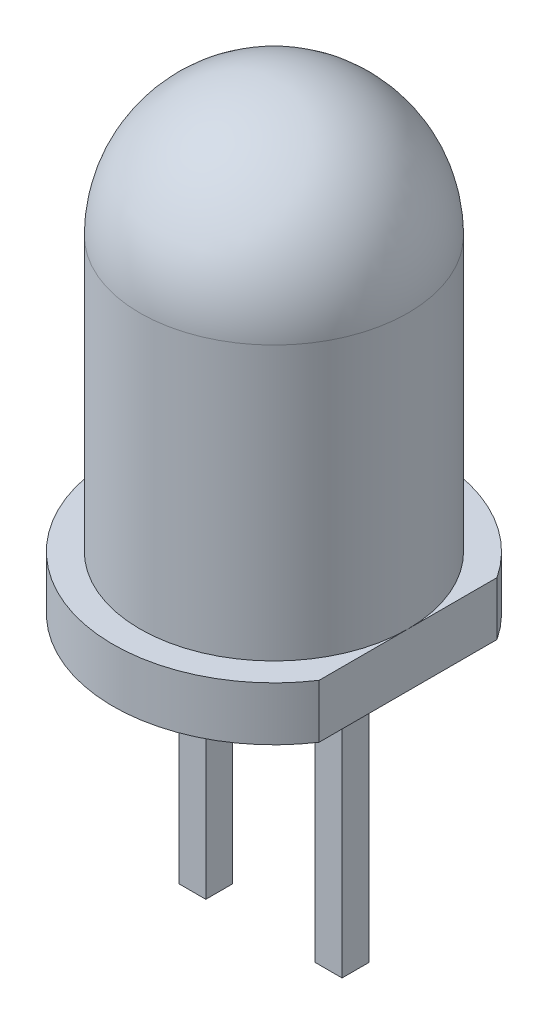
ISO-10303-21;
HEADER;
FILE_DESCRIPTION(('STEP AP214'),'2;1');
FILE_NAME('part.step','',(''),(''),'','','');
FILE_SCHEMA(('AUTOMOTIVE_DESIGN { 1 0 10303 214 1 1 1 1 }'));
ENDSEC;
DATA;
#1=APPLICATION_CONTEXT('core data for automotive mechanical design processes');
#2=APPLICATION_PROTOCOL_DEFINITION('international standard','automotive_design',2000,#1);
#3=PRODUCT_CONTEXT('',#1,'mechanical');
#4=PRODUCT('Part','Part','',(#3));
#5=PRODUCT_RELATED_PRODUCT_CATEGORY('part','',(#4));
#6=PRODUCT_DEFINITION_FORMATION('','',#4);
#7=PRODUCT_DEFINITION_CONTEXT('part definition',#1,'design');
#8=PRODUCT_DEFINITION('design','',#6,#7);
#9=PRODUCT_DEFINITION_SHAPE('','',#8);
#10=(LENGTH_UNIT() NAMED_UNIT(*) SI_UNIT(.MILLI.,.METRE.));
#11=(NAMED_UNIT(*) PLANE_ANGLE_UNIT() SI_UNIT($,.RADIAN.));
#12=(NAMED_UNIT(*) SI_UNIT($,.STERADIAN.) SOLID_ANGLE_UNIT());
#13=UNCERTAINTY_MEASURE_WITH_UNIT(LENGTH_MEASURE(1.E-05),#10,'distance_accuracy_value','');
#14=(GEOMETRIC_REPRESENTATION_CONTEXT(3) GLOBAL_UNCERTAINTY_ASSIGNED_CONTEXT((#13)) GLOBAL_UNIT_ASSIGNED_CONTEXT((#10,
#11,#12)) REPRESENTATION_CONTEXT('',''));
#15=CARTESIAN_POINT('',(0.,0.,0.));
#16=DIRECTION('',(0.,0.,1.));
#17=DIRECTION('',(1.,0.,0.));
#18=AXIS2_PLACEMENT_3D('',#15,#16,#17);
#19=CARTESIAN_POINT('',(-1.02,-5.,0.25));
#20=DIRECTION('',(-1.,0.,0.));
#21=DIRECTION('',(0.,0.,1.));
#22=AXIS2_PLACEMENT_3D('',#19,#20,#21);
#23=PLANE('',#22);
#24=DIRECTION('',(0.,0.,1.));
#25=VECTOR('',#24,1.);
#26=CARTESIAN_POINT('',(-1.02,0.,0.25));
#27=LINE('',#26,#25);
#28=CARTESIAN_POINT('',(-1.02,0.,-0.25));
#29=VERTEX_POINT('',#28);
#30=CARTESIAN_POINT('',(-1.02,0.,0.25));
#31=VERTEX_POINT('',#30);
#32=EDGE_CURVE('P0_E79',#29,#31,#27,.T.);
#33=ORIENTED_EDGE('',*,*,#32,.T.);
#34=DIRECTION('',(0.,1.,0.));
#35=VECTOR('',#34,1.);
#36=CARTESIAN_POINT('',(-1.02,-5.,0.25));
#37=LINE('',#36,#35);
#38=CARTESIAN_POINT('',(-1.02,-5.,0.25));
#39=VERTEX_POINT('',#38);
#40=EDGE_CURVE('P0_E10',#39,#31,#37,.T.);
#41=ORIENTED_EDGE('',*,*,#40,.F.);
#42=DIRECTION('',(0.,0.,1.));
#43=VECTOR('',#42,1.);
#44=CARTESIAN_POINT('',(-1.02,-5.,0.25));
#45=LINE('',#44,#43);
#46=CARTESIAN_POINT('',(-1.02,-5.,-0.25));
#47=VERTEX_POINT('',#46);
#48=EDGE_CURVE('P0_E67',#47,#39,#45,.T.);
#49=ORIENTED_EDGE('',*,*,#48,.F.);
#50=DIRECTION('',(0.,1.,0.));
#51=VECTOR('',#50,1.);
#52=CARTESIAN_POINT('',(-1.02,-5.,-0.25));
#53=LINE('',#52,#51);
#54=EDGE_CURVE('P0_E75',#47,#29,#53,.T.);
#55=ORIENTED_EDGE('',*,*,#54,.T.);
#56=EDGE_LOOP('',(#33,#41,#49,#55));
#57=FACE_BOUND('',#56,.T.);
#58=ADVANCED_FACE('P0_F16',(#57),#23,.F.);
#59=CARTESIAN_POINT('',(-1.52,-5.,0.25));
#60=DIRECTION('',(0.,0.,-1.));
#61=DIRECTION('',(-1.,0.,0.));
#62=AXIS2_PLACEMENT_3D('',#59,#60,#61);
#63=PLANE('',#62);
#64=DIRECTION('',(-1.,0.,0.));
#65=VECTOR('',#64,1.);
#66=CARTESIAN_POINT('',(-1.52,0.,0.25));
#67=LINE('',#66,#65);
#68=CARTESIAN_POINT('',(-1.52,0.,0.25));
#69=VERTEX_POINT('',#68);
#70=EDGE_CURVE('P0_E71',#31,#69,#67,.T.);
#71=ORIENTED_EDGE('',*,*,#70,.T.);
#72=DIRECTION('',(0.,1.,0.));
#73=VECTOR('',#72,1.);
#74=CARTESIAN_POINT('',(-1.52,-5.,0.25));
#75=LINE('',#74,#73);
#76=CARTESIAN_POINT('',(-1.52,-5.,0.25));
#77=VERTEX_POINT('',#76);
#78=EDGE_CURVE('P0_E24',#77,#69,#75,.T.);
#79=ORIENTED_EDGE('',*,*,#78,.F.);
#80=DIRECTION('',(-1.,0.,0.));
#81=VECTOR('',#80,1.);
#82=CARTESIAN_POINT('',(-1.52,-5.,0.25));
#83=LINE('',#82,#81);
#84=EDGE_CURVE('P0_E62',#39,#77,#83,.T.);
#85=ORIENTED_EDGE('',*,*,#84,.F.);
#86=ORIENTED_EDGE('',*,*,#40,.T.);
#87=EDGE_LOOP('',(#71,#79,#85,#86));
#88=FACE_BOUND('',#87,.T.);
#89=ADVANCED_FACE('P0_F70',(#88),#63,.F.);
#90=CARTESIAN_POINT('',(-1.52,-5.,0.25));
#91=DIRECTION('',(1.,0.,0.));
#92=DIRECTION('',(0.,0.,-1.));
#93=AXIS2_PLACEMENT_3D('',#90,#91,#92);
#94=PLANE('',#93);
#95=DIRECTION('',(0.,0.,-1.));
#96=VECTOR('',#95,1.);
#97=CARTESIAN_POINT('',(-1.52,0.,0.25));
#98=LINE('',#97,#96);
#99=CARTESIAN_POINT('',(-1.52,0.,-0.25));
#100=VERTEX_POINT('',#99);
#101=EDGE_CURVE('P0_E49',#69,#100,#98,.T.);
#102=ORIENTED_EDGE('',*,*,#101,.T.);
#103=DIRECTION('',(0.,1.,0.));
#104=VECTOR('',#103,1.);
#105=CARTESIAN_POINT('',(-1.52,-5.,-0.25));
#106=LINE('',#105,#104);
#107=CARTESIAN_POINT('',(-1.52,-5.,-0.25));
#108=VERTEX_POINT('',#107);
#109=EDGE_CURVE('P0_E72',#108,#100,#106,.T.);
#110=ORIENTED_EDGE('',*,*,#109,.F.);
#111=DIRECTION('',(0.,0.,-1.));
#112=VECTOR('',#111,1.);
#113=CARTESIAN_POINT('',(-1.52,-5.,0.25));
#114=LINE('',#113,#112);
#115=EDGE_CURVE('P0_E65',#77,#108,#114,.T.);
#116=ORIENTED_EDGE('',*,*,#115,.F.);
#117=ORIENTED_EDGE('',*,*,#78,.T.);
#118=EDGE_LOOP('',(#102,#110,#116,#117));
#119=FACE_BOUND('',#118,.T.);
#120=ADVANCED_FACE('P0_F73',(#119),#94,.F.);
#121=CARTESIAN_POINT('',(-1.52,-5.,-0.25));
#122=DIRECTION('',(0.,0.,1.));
#123=DIRECTION('',(1.,0.,0.));
#124=AXIS2_PLACEMENT_3D('',#121,#122,#123);
#125=PLANE('',#124);
#126=DIRECTION('',(1.,0.,0.));
#127=VECTOR('',#126,1.);
#128=CARTESIAN_POINT('',(-1.52,0.,-0.25));
#129=LINE('',#128,#127);
#130=EDGE_CURVE('P0_E55',#100,#29,#129,.T.);
#131=ORIENTED_EDGE('',*,*,#130,.T.);
#132=ORIENTED_EDGE('',*,*,#54,.F.);
#133=DIRECTION('',(1.,0.,0.));
#134=VECTOR('',#133,1.);
#135=CARTESIAN_POINT('',(-1.52,-5.,-0.25));
#136=LINE('',#135,#134);
#137=EDGE_CURVE('P0_E32',#108,#47,#136,.T.);
#138=ORIENTED_EDGE('',*,*,#137,.F.);
#139=ORIENTED_EDGE('',*,*,#109,.T.);
#140=EDGE_LOOP('',(#131,#132,#138,#139));
#141=FACE_BOUND('',#140,.T.);
#142=ADVANCED_FACE('P0_F86',(#141),#125,.F.);
#143=CARTESIAN_POINT('',(0.,-5.,0.));
#144=DIRECTION('',(0.,-1.,0.));
#145=DIRECTION('',(0.,0.,-1.));
#146=AXIS2_PLACEMENT_3D('',#143,#144,#145);
#147=PLANE('',#146);
#148=ORIENTED_EDGE('',*,*,#48,.T.);
#149=ORIENTED_EDGE('',*,*,#84,.T.);
#150=ORIENTED_EDGE('',*,*,#115,.T.);
#151=ORIENTED_EDGE('',*,*,#137,.T.);
#152=EDGE_LOOP('',(#148,#149,#150,#151));
#153=FACE_BOUND('',#152,.T.);
#154=ADVANCED_FACE('P0_F63',(#153),#147,.T.);
#155=CARTESIAN_POINT('',(0.,0.,0.));
#156=DIRECTION('',(0.,-1.,0.));
#157=DIRECTION('',(0.,0.,-1.));
#158=AXIS2_PLACEMENT_3D('',#155,#156,#157);
#159=PLANE('',#158);
#160=ORIENTED_EDGE('',*,*,#32,.F.);
#161=ORIENTED_EDGE('',*,*,#130,.F.);
#162=ORIENTED_EDGE('',*,*,#101,.F.);
#163=ORIENTED_EDGE('',*,*,#70,.F.);
#164=EDGE_LOOP('',(#160,#161,#162,#163));
#165=FACE_BOUND('',#164,.T.);
#166=ADVANCED_FACE('P0_F89',(#165),#159,.F.);
#167=CLOSED_SHELL('',(#58,#89,#120,#142,#154,#166));
#168=MANIFOLD_SOLID_BREP('P0_B1',#167);
#169=CARTESIAN_POINT('',(1.02,-5.,0.25));
#170=DIRECTION('',(1.,0.,0.));
#171=DIRECTION('',(0.,0.,-1.));
#172=AXIS2_PLACEMENT_3D('',#169,#170,#171);
#173=PLANE('',#172);
#174=DIRECTION('',(0.,0.,-1.));
#175=VECTOR('',#174,1.);
#176=CARTESIAN_POINT('',(1.02,0.,0.25));
#177=LINE('',#176,#175);
#178=CARTESIAN_POINT('',(1.02,0.,0.25));
#179=VERTEX_POINT('',#178);
#180=CARTESIAN_POINT('',(1.02,0.,-0.25));
#181=VERTEX_POINT('',#180);
#182=EDGE_CURVE('P1_E80',#179,#181,#177,.T.);
#183=ORIENTED_EDGE('',*,*,#182,.T.);
#184=DIRECTION('',(0.,1.,0.));
#185=VECTOR('',#184,1.);
#186=CARTESIAN_POINT('',(1.02,-5.,-0.25));
#187=LINE('',#186,#185);
#188=CARTESIAN_POINT('',(1.02,-5.,-0.25));
#189=VERTEX_POINT('',#188);
#190=EDGE_CURVE('P1_E11',#189,#181,#187,.T.);
#191=ORIENTED_EDGE('',*,*,#190,.F.);
#192=DIRECTION('',(0.,0.,-1.));
#193=VECTOR('',#192,1.);
#194=CARTESIAN_POINT('',(1.02,-5.,0.25));
#195=LINE('',#194,#193);
#196=CARTESIAN_POINT('',(1.02,-5.,0.25));
#197=VERTEX_POINT('',#196);
#198=EDGE_CURVE('P1_E68',#197,#189,#195,.T.);
#199=ORIENTED_EDGE('',*,*,#198,.F.);
#200=DIRECTION('',(0.,1.,0.));
#201=VECTOR('',#200,1.);
#202=CARTESIAN_POINT('',(1.02,-5.,0.25));
#203=LINE('',#202,#201);
#204=EDGE_CURVE('P1_E76',#197,#179,#203,.T.);
#205=ORIENTED_EDGE('',*,*,#204,.T.);
#206=EDGE_LOOP('',(#183,#191,#199,#205));
#207=FACE_BOUND('',#206,.T.);
#208=ADVANCED_FACE('P1_F17',(#207),#173,.F.);
#209=CARTESIAN_POINT('',(1.52,-5.,-0.25));
#210=DIRECTION('',(0.,0.,1.));
#211=DIRECTION('',(1.,0.,0.));
#212=AXIS2_PLACEMENT_3D('',#209,#210,#211);
#213=PLANE('',#212);
#214=DIRECTION('',(1.,0.,0.));
#215=VECTOR('',#214,1.);
#216=CARTESIAN_POINT('',(1.52,0.,-0.25));
#217=LINE('',#216,#215);
#218=CARTESIAN_POINT('',(1.52,0.,-0.25));
#219=VERTEX_POINT('',#218);
#220=EDGE_CURVE('P1_E72',#181,#219,#217,.T.);
#221=ORIENTED_EDGE('',*,*,#220,.T.);
#222=DIRECTION('',(0.,1.,0.));
#223=VECTOR('',#222,1.);
#224=CARTESIAN_POINT('',(1.52,-5.,-0.25));
#225=LINE('',#224,#223);
#226=CARTESIAN_POINT('',(1.52,-5.,-0.25));
#227=VERTEX_POINT('',#226);
#228=EDGE_CURVE('P1_E25',#227,#219,#225,.T.);
#229=ORIENTED_EDGE('',*,*,#228,.F.);
#230=DIRECTION('',(1.,0.,0.));
#231=VECTOR('',#230,1.);
#232=CARTESIAN_POINT('',(1.52,-5.,-0.25));
#233=LINE('',#232,#231);
#234=EDGE_CURVE('P1_E63',#189,#227,#233,.T.);
#235=ORIENTED_EDGE('',*,*,#234,.F.);
#236=ORIENTED_EDGE('',*,*,#190,.T.);
#237=EDGE_LOOP('',(#221,#229,#235,#236));
#238=FACE_BOUND('',#237,.T.);
#239=ADVANCED_FACE('P1_F71',(#238),#213,.F.);
#240=CARTESIAN_POINT('',(1.52,-5.,0.25));
#241=DIRECTION('',(-1.,0.,0.));
#242=DIRECTION('',(0.,0.,1.));
#243=AXIS2_PLACEMENT_3D('',#240,#241,#242);
#244=PLANE('',#243);
#245=DIRECTION('',(0.,0.,1.));
#246=VECTOR('',#245,1.);
#247=CARTESIAN_POINT('',(1.52,0.,0.25));
#248=LINE('',#247,#246);
#249=CARTESIAN_POINT('',(1.52,0.,0.25));
#250=VERTEX_POINT('',#249);
#251=EDGE_CURVE('P1_E50',#219,#250,#248,.T.);
#252=ORIENTED_EDGE('',*,*,#251,.T.);
#253=DIRECTION('',(0.,1.,0.));
#254=VECTOR('',#253,1.);
#255=CARTESIAN_POINT('',(1.52,-5.,0.25));
#256=LINE('',#255,#254);
#257=CARTESIAN_POINT('',(1.52,-5.,0.25));
#258=VERTEX_POINT('',#257);
#259=EDGE_CURVE('P1_E73',#258,#250,#256,.T.);
#260=ORIENTED_EDGE('',*,*,#259,.F.);
#261=DIRECTION('',(0.,0.,1.));
#262=VECTOR('',#261,1.);
#263=CARTESIAN_POINT('',(1.52,-5.,0.25));
#264=LINE('',#263,#262);
#265=EDGE_CURVE('P1_E66',#227,#258,#264,.T.);
#266=ORIENTED_EDGE('',*,*,#265,.F.);
#267=ORIENTED_EDGE('',*,*,#228,.T.);
#268=EDGE_LOOP('',(#252,#260,#266,#267));
#269=FACE_BOUND('',#268,.T.);
#270=ADVANCED_FACE('P1_F74',(#269),#244,.F.);
#271=CARTESIAN_POINT('',(1.52,-5.,0.25));
#272=DIRECTION('',(0.,0.,-1.));
#273=DIRECTION('',(-1.,0.,0.));
#274=AXIS2_PLACEMENT_3D('',#271,#272,#273);
#275=PLANE('',#274);
#276=DIRECTION('',(-1.,0.,0.));
#277=VECTOR('',#276,1.);
#278=CARTESIAN_POINT('',(1.52,0.,0.25));
#279=LINE('',#278,#277);
#280=EDGE_CURVE('P1_E56',#250,#179,#279,.T.);
#281=ORIENTED_EDGE('',*,*,#280,.T.);
#282=ORIENTED_EDGE('',*,*,#204,.F.);
#283=DIRECTION('',(-1.,0.,0.));
#284=VECTOR('',#283,1.);
#285=CARTESIAN_POINT('',(1.52,-5.,0.25));
#286=LINE('',#285,#284);
#287=EDGE_CURVE('P1_E33',#258,#197,#286,.T.);
#288=ORIENTED_EDGE('',*,*,#287,.F.);
#289=ORIENTED_EDGE('',*,*,#259,.T.);
#290=EDGE_LOOP('',(#281,#282,#288,#289));
#291=FACE_BOUND('',#290,.T.);
#292=ADVANCED_FACE('P1_F87',(#291),#275,.F.);
#293=CARTESIAN_POINT('',(0.,-5.,0.));
#294=DIRECTION('',(0.,1.,0.));
#295=DIRECTION('',(0.,0.,1.));
#296=AXIS2_PLACEMENT_3D('',#293,#294,#295);
#297=PLANE('',#296);
#298=ORIENTED_EDGE('',*,*,#198,.T.);
#299=ORIENTED_EDGE('',*,*,#234,.T.);
#300=ORIENTED_EDGE('',*,*,#265,.T.);
#301=ORIENTED_EDGE('',*,*,#287,.T.);
#302=EDGE_LOOP('',(#298,#299,#300,#301));
#303=FACE_BOUND('',#302,.T.);
#304=ADVANCED_FACE('P1_F64',(#303),#297,.F.);
#305=CARTESIAN_POINT('',(0.,0.,0.));
#306=DIRECTION('',(0.,1.,0.));
#307=DIRECTION('',(0.,0.,1.));
#308=AXIS2_PLACEMENT_3D('',#305,#306,#307);
#309=PLANE('',#308);
#310=ORIENTED_EDGE('',*,*,#182,.F.);
#311=ORIENTED_EDGE('',*,*,#280,.F.);
#312=ORIENTED_EDGE('',*,*,#251,.F.);
#313=ORIENTED_EDGE('',*,*,#220,.F.);
#314=EDGE_LOOP('',(#310,#311,#312,#313));
#315=FACE_BOUND('',#314,.T.);
#316=ADVANCED_FACE('P1_F90',(#315),#309,.T.);
#317=CLOSED_SHELL('',(#208,#239,#270,#292,#304,#316));
#318=MANIFOLD_SOLID_BREP('P1_B1',#317);
#319=CARTESIAN_POINT('',(0.,1.,0.));
#320=DIRECTION('',(0.,-1.,0.));
#321=DIRECTION('',(0.,0.,-1.));
#322=AXIS2_PLACEMENT_3D('',#319,#320,#321);
#323=CYLINDRICAL_SURFACE('',#322,3.);
#324=CARTESIAN_POINT('',(0.,0.,0.));
#325=DIRECTION('',(0.,-1.,0.));
#326=DIRECTION('',(0.,0.,-1.));
#327=AXIS2_PLACEMENT_3D('',#324,#325,#326);
#328=CIRCLE('',#327,3.);
#329=CARTESIAN_POINT('',(2.5,0.,1.6583123951777));
#330=VERTEX_POINT('',#329);
#331=CARTESIAN_POINT('',(2.5,0.,-1.6583123951777));
#332=VERTEX_POINT('',#331);
#333=EDGE_CURVE('P2_E55',#330,#332,#328,.T.);
#334=ORIENTED_EDGE('',*,*,#333,.F.);
#335=DIRECTION('',(0.,-1.,0.));
#336=VECTOR('',#335,1.);
#337=CARTESIAN_POINT('',(2.5,8.6,1.6583123951777));
#338=LINE('',#337,#336);
#339=CARTESIAN_POINT('',(2.5,1.,1.6583123951777));
#340=VERTEX_POINT('',#339);
#341=EDGE_CURVE('P2_E32',#340,#330,#338,.T.);
#342=ORIENTED_EDGE('',*,*,#341,.F.);
#343=CARTESIAN_POINT('',(0.,1.,0.));
#344=DIRECTION('',(0.,-1.,0.));
#345=DIRECTION('',(0.,0.,-1.));
#346=AXIS2_PLACEMENT_3D('',#343,#344,#345);
#347=CIRCLE('',#346,3.);
#348=CARTESIAN_POINT('',(2.5,1.,-1.6583123951777));
#349=VERTEX_POINT('',#348);
#350=EDGE_CURVE('P2_E57',#340,#349,#347,.T.);
#351=ORIENTED_EDGE('',*,*,#350,.T.);
#352=DIRECTION('',(0.,-1.,0.));
#353=VECTOR('',#352,1.);
#354=CARTESIAN_POINT('',(2.5,8.6,-1.6583123951777));
#355=LINE('',#354,#353);
#356=EDGE_CURVE('P2_E48',#349,#332,#355,.T.);
#357=ORIENTED_EDGE('',*,*,#356,.T.);
#358=EDGE_LOOP('',(#334,#342,#351,#357));
#359=FACE_BOUND('',#358,.T.);
#360=ADVANCED_FACE('P2_F17',(#359),#323,.T.);
#361=CARTESIAN_POINT('',(0.,1.,0.));
#362=DIRECTION('',(0.,-1.,0.));
#363=DIRECTION('',(0.,0.,-1.));
#364=AXIS2_PLACEMENT_3D('',#361,#362,#363);
#365=PLANE('',#364);
#366=DIRECTION('',(0.,0.,1.));
#367=VECTOR('',#366,1.);
#368=CARTESIAN_POINT('',(2.5,1.,0.));
#369=LINE('',#368,#367);
#370=CARTESIAN_POINT('',(2.5,1.,0.));
#371=VERTEX_POINT('',#370);
#372=EDGE_CURVE('P2_E38',#349,#371,#369,.T.);
#373=ORIENTED_EDGE('',*,*,#372,.F.);
#374=ORIENTED_EDGE('',*,*,#350,.F.);
#375=EDGE_CURVE('P2_E61',#371,#340,#369,.T.);
#376=ORIENTED_EDGE('',*,*,#375,.F.);
#377=CARTESIAN_POINT('',(0.,1.,0.));
#378=DIRECTION('',(0.,-1.,0.));
#379=DIRECTION('',(0.,0.,-1.));
#380=AXIS2_PLACEMENT_3D('',#377,#378,#379);
#381=CIRCLE('',#380,2.5);
#382=EDGE_CURVE('P2_E21',#371,#371,#381,.F.);
#383=ORIENTED_EDGE('',*,*,#382,.F.);
#384=EDGE_LOOP('',(#373,#374,#376,#383));
#385=FACE_BOUND('',#384,.T.);
#386=ADVANCED_FACE('P2_F67',(#385),#365,.F.);
#387=CARTESIAN_POINT('',(-2.5,0.,0.));
#388=DIRECTION('',(0.,-1.,0.));
#389=DIRECTION('',(0.,0.,-1.));
#390=AXIS2_PLACEMENT_3D('',#387,#388,#389);
#391=PLANE('',#390);
#392=ORIENTED_EDGE('',*,*,#333,.T.);
#393=DIRECTION('',(0.,0.,1.));
#394=VECTOR('',#393,1.);
#395=CARTESIAN_POINT('',(2.5,0.,0.));
#396=LINE('',#395,#394);
#397=EDGE_CURVE('P2_E45',#332,#330,#396,.T.);
#398=ORIENTED_EDGE('',*,*,#397,.T.);
#399=EDGE_LOOP('',(#392,#398));
#400=FACE_BOUND('',#399,.T.);
#401=ADVANCED_FACE('P2_F19',(#400),#391,.T.);
#402=CARTESIAN_POINT('',(0.,0.,0.));
#403=DIRECTION('',(0.,1.,0.));
#404=DIRECTION('',(0.,0.,1.));
#405=AXIS2_PLACEMENT_3D('',#402,#403,#404);
#406=CYLINDRICAL_SURFACE('',#405,2.5);
#407=ORIENTED_EDGE('',*,*,#382,.T.);
#408=EDGE_LOOP('',(#407));
#409=FACE_BOUND('',#408,.T.);
#410=CARTESIAN_POINT('',(0.,6.1,0.));
#411=DIRECTION('',(0.,1.,0.));
#412=DIRECTION('',(0.,0.,1.));
#413=AXIS2_PLACEMENT_3D('',#410,#411,#412);
#414=CIRCLE('',#413,2.5);
#415=CARTESIAN_POINT('',(0.,6.1,2.5));
#416=VERTEX_POINT('',#415);
#417=EDGE_CURVE('P2_E11',#416,#416,#414,.T.);
#418=ORIENTED_EDGE('',*,*,#417,.F.);
#419=EDGE_LOOP('',(#418));
#420=FACE_BOUND('',#419,.T.);
#421=ADVANCED_FACE('P2_F69',(#409,#420),#406,.T.);
#422=CARTESIAN_POINT('',(0.,6.1,0.));
#423=DIRECTION('',(0.,1.,0.));
#424=DIRECTION('',(1.,0.,0.));
#425=AXIS2_PLACEMENT_3D('',#422,#423,#424);
#426=SPHERICAL_SURFACE('',#425,2.5);
#427=ORIENTED_EDGE('',*,*,#417,.T.);
#428=EDGE_LOOP('',(#427));
#429=FACE_BOUND('',#428,.T.);
#430=ADVANCED_FACE('P2_F72',(#429),#426,.T.);
#431=CARTESIAN_POINT('',(2.5,8.6,0.));
#432=DIRECTION('',(1.,0.,0.));
#433=DIRECTION('',(0.,0.,-1.));
#434=AXIS2_PLACEMENT_3D('',#431,#432,#433);
#435=PLANE('',#434);
#436=ORIENTED_EDGE('',*,*,#372,.T.);
#437=ORIENTED_EDGE('',*,*,#375,.T.);
#438=ORIENTED_EDGE('',*,*,#341,.T.);
#439=ORIENTED_EDGE('',*,*,#397,.F.);
#440=ORIENTED_EDGE('',*,*,#356,.F.);
#441=EDGE_LOOP('',(#436,#437,#438,#439,#440));
#442=FACE_BOUND('',#441,.T.);
#443=ADVANCED_FACE('P2_F47',(#442),#435,.T.);
#444=CLOSED_SHELL('',(#360,#386,#401,#421,#430,#443));
#445=MANIFOLD_SOLID_BREP('P2_B1',#444);
#446=ADVANCED_BREP_SHAPE_REPRESENTATION('',(#18,#168,#318,#445),#14);
#447=SHAPE_DEFINITION_REPRESENTATION(#9,#446);
ENDSEC;
END-ISO-10303-21;
